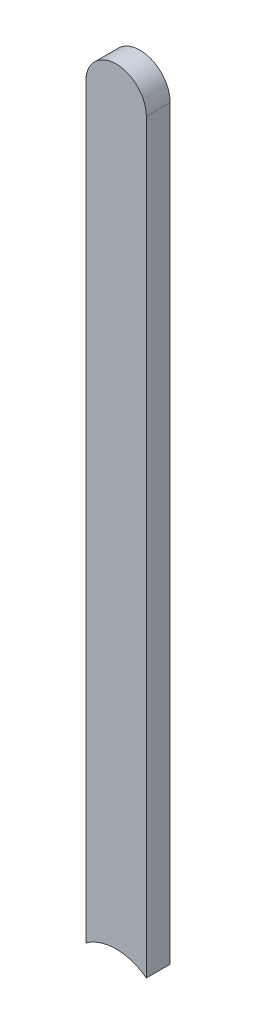
ISO-10303-21;
HEADER;
FILE_DESCRIPTION(('STEP AP214'),'2;1');
FILE_NAME('part.step','',(''),(''),'','','');
FILE_SCHEMA(('AUTOMOTIVE_DESIGN { 1 0 10303 214 1 1 1 1 }'));
ENDSEC;
DATA;
#1=APPLICATION_CONTEXT('core data for automotive mechanical design processes');
#2=APPLICATION_PROTOCOL_DEFINITION('international standard','automotive_design',2000,#1);
#3=PRODUCT_CONTEXT('',#1,'mechanical');
#4=PRODUCT('Part','Part','',(#3));
#5=PRODUCT_RELATED_PRODUCT_CATEGORY('part','',(#4));
#6=PRODUCT_DEFINITION_FORMATION('','',#4);
#7=PRODUCT_DEFINITION_CONTEXT('part definition',#1,'design');
#8=PRODUCT_DEFINITION('design','',#6,#7);
#9=PRODUCT_DEFINITION_SHAPE('','',#8);
#10=(LENGTH_UNIT() NAMED_UNIT(*) SI_UNIT(.MILLI.,.METRE.));
#11=(NAMED_UNIT(*) PLANE_ANGLE_UNIT() SI_UNIT($,.RADIAN.));
#12=(NAMED_UNIT(*) SI_UNIT($,.STERADIAN.) SOLID_ANGLE_UNIT());
#13=UNCERTAINTY_MEASURE_WITH_UNIT(LENGTH_MEASURE(1.E-05),#10,'distance_accuracy_value','');
#14=(GEOMETRIC_REPRESENTATION_CONTEXT(3) GLOBAL_UNCERTAINTY_ASSIGNED_CONTEXT((#13)) GLOBAL_UNIT_ASSIGNED_CONTEXT((#10,
#11,#12)) REPRESENTATION_CONTEXT('',''));
#15=CARTESIAN_POINT('',(0.,0.,0.));
#16=DIRECTION('',(0.,0.,1.));
#17=DIRECTION('',(1.,0.,0.));
#18=AXIS2_PLACEMENT_3D('',#15,#16,#17);
#19=CARTESIAN_POINT('',(93.5550072,58.5067482311035,0.));
#20=DIRECTION('',(-1.,0.,0.));
#21=DIRECTION('',(0.,1.,0.));
#22=AXIS2_PLACEMENT_3D('',#19,#20,#21);
#23=PLANE('',#22);
#24=DIRECTION('',(0.,1.,0.));
#25=VECTOR('',#24,1.);
#26=CARTESIAN_POINT('',(93.5550072,58.166,0.1999996));
#27=LINE('',#26,#25);
#28=CARTESIAN_POINT('',(93.5550072,58.5067482311035,0.1999996));
#29=VERTEX_POINT('',#28);
#30=CARTESIAN_POINT('',(93.5550072,64.77,0.1999996));
#31=VERTEX_POINT('',#30);
#32=EDGE_CURVE('E11',#29,#31,#27,.T.);
#33=ORIENTED_EDGE('',*,*,#32,.F.);
#34=DIRECTION('',(0.,0.,1.));
#35=VECTOR('',#34,1.);
#36=CARTESIAN_POINT('',(93.5550072,58.5067482311035,0.));
#37=LINE('',#36,#35);
#38=CARTESIAN_POINT('',(93.5550072,58.5067482311035,0.));
#39=VERTEX_POINT('',#38);
#40=EDGE_CURVE('E24',#39,#29,#37,.T.);
#41=ORIENTED_EDGE('',*,*,#40,.F.);
#42=DIRECTION('',(0.,1.,0.));
#43=VECTOR('',#42,1.);
#44=CARTESIAN_POINT('',(93.5550072,58.166,0.));
#45=LINE('',#44,#43);
#46=CARTESIAN_POINT('',(93.5550072,64.77,0.));
#47=VERTEX_POINT('',#46);
#48=EDGE_CURVE('E75',#39,#47,#45,.T.);
#49=ORIENTED_EDGE('',*,*,#48,.T.);
#50=DIRECTION('',(0.,0.,1.));
#51=VECTOR('',#50,1.);
#52=CARTESIAN_POINT('',(93.5550072,64.77,0.));
#53=LINE('',#52,#51);
#54=EDGE_CURVE('E37',#47,#31,#53,.T.);
#55=ORIENTED_EDGE('',*,*,#54,.T.);
#56=EDGE_LOOP('',(#33,#41,#49,#55));
#57=FACE_BOUND('',#56,.T.);
#58=ADVANCED_FACE('F17',(#57),#23,.F.);
#59=CARTESIAN_POINT('',(93.3010072,64.77,0.));
#60=DIRECTION('',(0.,0.,-1.));
#61=DIRECTION('',(1.,0.,0.));
#62=AXIS2_PLACEMENT_3D('',#59,#60,#61);
#63=CYLINDRICAL_SURFACE('',#62,0.254);
#64=CARTESIAN_POINT('',(93.3010072,64.77,0.1999996));
#65=DIRECTION('',(0.,0.,1.));
#66=DIRECTION('',(1.,0.,0.));
#67=AXIS2_PLACEMENT_3D('',#64,#65,#66);
#68=CIRCLE('',#67,0.254);
#69=CARTESIAN_POINT('',(93.0470072,64.77,0.1999996));
#70=VERTEX_POINT('',#69);
#71=EDGE_CURVE('E83',#31,#70,#68,.T.);
#72=ORIENTED_EDGE('',*,*,#71,.F.);
#73=ORIENTED_EDGE('',*,*,#54,.F.);
#74=CARTESIAN_POINT('',(93.3010072,64.77,0.));
#75=DIRECTION('',(0.,0.,1.));
#76=DIRECTION('',(1.,0.,0.));
#77=AXIS2_PLACEMENT_3D('',#74,#75,#76);
#78=CIRCLE('',#77,0.254);
#79=CARTESIAN_POINT('',(93.0470072,64.77,0.));
#80=VERTEX_POINT('',#79);
#81=EDGE_CURVE('E81',#47,#80,#78,.T.);
#82=ORIENTED_EDGE('',*,*,#81,.T.);
#83=DIRECTION('',(0.,0.,1.));
#84=VECTOR('',#83,1.);
#85=CARTESIAN_POINT('',(93.0470072,64.77,0.));
#86=LINE('',#85,#84);
#87=EDGE_CURVE('E67',#80,#70,#86,.T.);
#88=ORIENTED_EDGE('',*,*,#87,.T.);
#89=EDGE_LOOP('',(#72,#73,#82,#88));
#90=FACE_BOUND('',#89,.T.);
#91=ADVANCED_FACE('F89',(#90),#63,.T.);
#92=CARTESIAN_POINT('',(93.0470072,64.77,0.));
#93=DIRECTION('',(1.,0.,0.));
#94=DIRECTION('',(0.,-1.,0.));
#95=AXIS2_PLACEMENT_3D('',#92,#93,#94);
#96=PLANE('',#95);
#97=DIRECTION('',(0.,-1.,0.));
#98=VECTOR('',#97,1.);
#99=CARTESIAN_POINT('',(93.0470072,64.77,0.1999996));
#100=LINE('',#99,#98);
#101=CARTESIAN_POINT('',(93.0470072,58.5067482311035,0.1999996));
#102=VERTEX_POINT('',#101);
#103=EDGE_CURVE('E71',#70,#102,#100,.T.);
#104=ORIENTED_EDGE('',*,*,#103,.F.);
#105=ORIENTED_EDGE('',*,*,#87,.F.);
#106=DIRECTION('',(0.,-1.,0.));
#107=VECTOR('',#106,1.);
#108=CARTESIAN_POINT('',(93.0470072,64.77,0.));
#109=LINE('',#108,#107);
#110=CARTESIAN_POINT('',(93.0470072,58.5067482311035,0.));
#111=VERTEX_POINT('',#110);
#112=EDGE_CURVE('E63',#80,#111,#109,.T.);
#113=ORIENTED_EDGE('',*,*,#112,.T.);
#114=DIRECTION('',(0.,0.,1.));
#115=VECTOR('',#114,1.);
#116=CARTESIAN_POINT('',(93.0470072,58.5067482311035,0.));
#117=LINE('',#116,#115);
#118=EDGE_CURVE('E53',#111,#102,#117,.T.);
#119=ORIENTED_EDGE('',*,*,#118,.T.);
#120=EDGE_LOOP('',(#104,#105,#113,#119));
#121=FACE_BOUND('',#120,.T.);
#122=ADVANCED_FACE('F66',(#121),#96,.F.);
#123=CARTESIAN_POINT('',(93.3010072,58.166,0.));
#124=DIRECTION('',(0.,0.,-1.));
#125=DIRECTION('',(1.,0.,0.));
#126=AXIS2_PLACEMENT_3D('',#123,#124,#125);
#127=CYLINDRICAL_SURFACE('',#126,0.42500042);
#128=ORIENTED_EDGE('',*,*,#40,.T.);
#129=CARTESIAN_POINT('',(93.3010072,58.166,0.1999996));
#130=DIRECTION('',(0.,0.,1.));
#131=DIRECTION('',(1.,0.,0.));
#132=AXIS2_PLACEMENT_3D('',#129,#130,#131);
#133=CIRCLE('',#132,0.42500042);
#134=EDGE_CURVE('E59',#29,#102,#133,.T.);
#135=ORIENTED_EDGE('',*,*,#134,.T.);
#136=ORIENTED_EDGE('',*,*,#118,.F.);
#137=CARTESIAN_POINT('',(93.3010072,58.166,0.));
#138=DIRECTION('',(0.,0.,1.));
#139=DIRECTION('',(1.,0.,0.));
#140=AXIS2_PLACEMENT_3D('',#137,#138,#139);
#141=CIRCLE('',#140,0.42500042);
#142=EDGE_CURVE('E57',#39,#111,#141,.T.);
#143=ORIENTED_EDGE('',*,*,#142,.F.);
#144=EDGE_LOOP('',(#128,#135,#136,#143));
#145=FACE_BOUND('',#144,.T.);
#146=ADVANCED_FACE('F55',(#145),#127,.F.);
#147=CARTESIAN_POINT('',(93.5550072,58.166,0.));
#148=DIRECTION('',(0.,0.,-1.));
#149=DIRECTION('',(-1.,0.,0.));
#150=AXIS2_PLACEMENT_3D('',#147,#148,#149);
#151=PLANE('',#150);
#152=ORIENTED_EDGE('',*,*,#48,.F.);
#153=ORIENTED_EDGE('',*,*,#142,.T.);
#154=ORIENTED_EDGE('',*,*,#112,.F.);
#155=ORIENTED_EDGE('',*,*,#81,.F.);
#156=EDGE_LOOP('',(#152,#153,#154,#155));
#157=FACE_BOUND('',#156,.T.);
#158=ADVANCED_FACE('F74',(#157),#151,.T.);
#159=CARTESIAN_POINT('',(93.5550072,58.166,0.1999996));
#160=DIRECTION('',(0.,0.,-1.));
#161=DIRECTION('',(-1.,0.,0.));
#162=AXIS2_PLACEMENT_3D('',#159,#160,#161);
#163=PLANE('',#162);
#164=ORIENTED_EDGE('',*,*,#134,.F.);
#165=ORIENTED_EDGE('',*,*,#32,.T.);
#166=ORIENTED_EDGE('',*,*,#71,.T.);
#167=ORIENTED_EDGE('',*,*,#103,.T.);
#168=EDGE_LOOP('',(#164,#165,#166,#167));
#169=FACE_BOUND('',#168,.T.);
#170=ADVANCED_FACE('F91',(#169),#163,.F.);
#171=CLOSED_SHELL('',(#58,#91,#122,#146,#158,#170));
#172=MANIFOLD_SOLID_BREP('B1',#171);
#173=ADVANCED_BREP_SHAPE_REPRESENTATION('',(#18,#172),#14);
#174=SHAPE_DEFINITION_REPRESENTATION(#9,#173);
ENDSEC;
END-ISO-10303-21;
